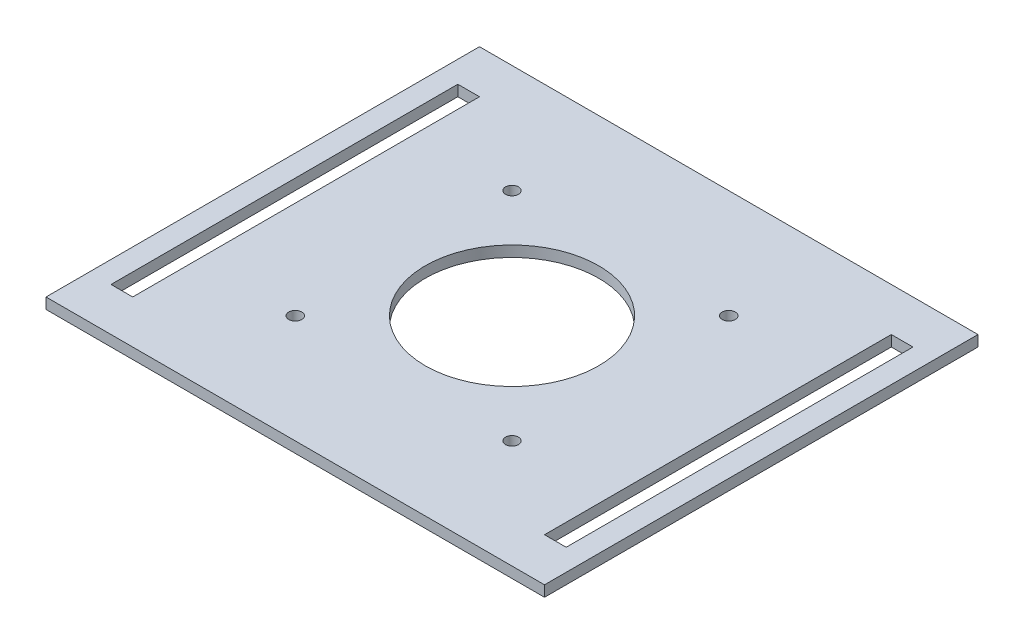
ISO-10303-21;
HEADER;
FILE_DESCRIPTION(('STEP AP214'),'2;1');
FILE_NAME('part.step','',(''),(''),'','','');
FILE_SCHEMA(('AUTOMOTIVE_DESIGN { 1 0 10303 214 1 1 1 1 }'));
ENDSEC;
DATA;
#1=APPLICATION_CONTEXT('core data for automotive mechanical design processes');
#2=APPLICATION_PROTOCOL_DEFINITION('international standard','automotive_design',2000,#1);
#3=PRODUCT_CONTEXT('',#1,'mechanical');
#4=PRODUCT('Part','Part','',(#3));
#5=PRODUCT_RELATED_PRODUCT_CATEGORY('part','',(#4));
#6=PRODUCT_DEFINITION_FORMATION('','',#4);
#7=PRODUCT_DEFINITION_CONTEXT('part definition',#1,'design');
#8=PRODUCT_DEFINITION('design','',#6,#7);
#9=PRODUCT_DEFINITION_SHAPE('','',#8);
#10=(LENGTH_UNIT() NAMED_UNIT(*) SI_UNIT(.MILLI.,.METRE.));
#11=(NAMED_UNIT(*) PLANE_ANGLE_UNIT() SI_UNIT($,.RADIAN.));
#12=(NAMED_UNIT(*) SI_UNIT($,.STERADIAN.) SOLID_ANGLE_UNIT());
#13=UNCERTAINTY_MEASURE_WITH_UNIT(LENGTH_MEASURE(1.E-05),#10,'distance_accuracy_value','');
#14=(GEOMETRIC_REPRESENTATION_CONTEXT(3) GLOBAL_UNCERTAINTY_ASSIGNED_CONTEXT((#13)) GLOBAL_UNIT_ASSIGNED_CONTEXT((#10,
#11,#12)) REPRESENTATION_CONTEXT('',''));
#15=CARTESIAN_POINT('',(0.,0.,0.));
#16=DIRECTION('',(0.,0.,1.));
#17=DIRECTION('',(1.,0.,0.));
#18=AXIS2_PLACEMENT_3D('',#15,#16,#17);
#19=CARTESIAN_POINT('',(1.11022302462516E-13,5.,-80.0000000000002));
#20=DIRECTION('',(0.,0.,1.));
#21=DIRECTION('',(1.,0.,0.));
#22=AXIS2_PLACEMENT_3D('',#19,#20,#21);
#23=PLANE('',#22);
#24=DIRECTION('',(-1.,0.,0.));
#25=VECTOR('',#24,1.);
#26=CARTESIAN_POINT('',(1.11022302462516E-13,0.,-80.0000000000002));
#27=LINE('',#26,#25);
#28=CARTESIAN_POINT('',(105.,0.,-80.));
#29=VERTEX_POINT('',#28);
#30=CARTESIAN_POINT('',(94.9999999999999,0.,-80.));
#31=VERTEX_POINT('',#30);
#32=EDGE_CURVE('E208',#29,#31,#27,.T.);
#33=ORIENTED_EDGE('',*,*,#32,.F.);
#34=DIRECTION('',(0.,-1.,0.));
#35=VECTOR('',#34,1.);
#36=CARTESIAN_POINT('',(105.,5.,-80.));
#37=LINE('',#36,#35);
#38=CARTESIAN_POINT('',(105.,5.,-80.));
#39=VERTEX_POINT('',#38);
#40=EDGE_CURVE('E11',#39,#29,#37,.T.);
#41=ORIENTED_EDGE('',*,*,#40,.F.);
#42=DIRECTION('',(-1.,0.,0.));
#43=VECTOR('',#42,1.);
#44=CARTESIAN_POINT('',(1.11022302462516E-13,5.,-80.0000000000002));
#45=LINE('',#44,#43);
#46=CARTESIAN_POINT('',(94.9999999999999,5.,-80.));
#47=VERTEX_POINT('',#46);
#48=EDGE_CURVE('E144',#39,#47,#45,.T.);
#49=ORIENTED_EDGE('',*,*,#48,.T.);
#50=DIRECTION('',(0.,-1.,0.));
#51=VECTOR('',#50,1.);
#52=CARTESIAN_POINT('',(94.9999999999999,5.,-80.));
#53=LINE('',#52,#51);
#54=EDGE_CURVE('E54',#47,#31,#53,.T.);
#55=ORIENTED_EDGE('',*,*,#54,.T.);
#56=EDGE_LOOP('',(#33,#41,#49,#55));
#57=FACE_BOUND('',#56,.T.);
#58=ADVANCED_FACE('F35',(#57),#23,.T.);
#59=CARTESIAN_POINT('',(105.,5.,0.));
#60=DIRECTION('',(1.,0.,0.));
#61=DIRECTION('',(0.,0.,-1.));
#62=AXIS2_PLACEMENT_3D('',#59,#60,#61);
#63=PLANE('',#62);
#64=DIRECTION('',(0.,0.,1.));
#65=VECTOR('',#64,1.);
#66=CARTESIAN_POINT('',(105.,0.,0.));
#67=LINE('',#66,#65);
#68=CARTESIAN_POINT('',(105.,0.,79.9999999999999));
#69=VERTEX_POINT('',#68);
#70=EDGE_CURVE('E149',#29,#69,#67,.T.);
#71=ORIENTED_EDGE('',*,*,#70,.T.);
#72=DIRECTION('',(0.,-1.,0.));
#73=VECTOR('',#72,1.);
#74=CARTESIAN_POINT('',(105.,5.,79.9999999999999));
#75=LINE('',#74,#73);
#76=CARTESIAN_POINT('',(105.,5.,79.9999999999999));
#77=VERTEX_POINT('',#76);
#78=EDGE_CURVE('E45',#77,#69,#75,.T.);
#79=ORIENTED_EDGE('',*,*,#78,.F.);
#80=DIRECTION('',(0.,0.,1.));
#81=VECTOR('',#80,1.);
#82=CARTESIAN_POINT('',(105.,5.,0.));
#83=LINE('',#82,#81);
#84=EDGE_CURVE('E139',#39,#77,#83,.T.);
#85=ORIENTED_EDGE('',*,*,#84,.F.);
#86=ORIENTED_EDGE('',*,*,#40,.T.);
#87=EDGE_LOOP('',(#71,#79,#85,#86));
#88=FACE_BOUND('',#87,.T.);
#89=ADVANCED_FACE('F147',(#88),#63,.F.);
#90=CARTESIAN_POINT('',(4.44089209850065E-13,5.,80.0000000000005));
#91=DIRECTION('',(0.,0.,1.));
#92=DIRECTION('',(1.,0.,0.));
#93=AXIS2_PLACEMENT_3D('',#90,#91,#92);
#94=PLANE('',#93);
#95=DIRECTION('',(-1.,0.,0.));
#96=VECTOR('',#95,1.);
#97=CARTESIAN_POINT('',(4.44089209850065E-13,0.,80.0000000000005));
#98=LINE('',#97,#96);
#99=CARTESIAN_POINT('',(95.,0.,80.));
#100=VERTEX_POINT('',#99);
#101=EDGE_CURVE('E211',#69,#100,#98,.T.);
#102=ORIENTED_EDGE('',*,*,#101,.T.);
#103=DIRECTION('',(0.,-1.,0.));
#104=VECTOR('',#103,1.);
#105=CARTESIAN_POINT('',(95.,5.,80.));
#106=LINE('',#105,#104);
#107=CARTESIAN_POINT('',(95.,5.,80.));
#108=VERTEX_POINT('',#107);
#109=EDGE_CURVE('E92',#108,#100,#106,.T.);
#110=ORIENTED_EDGE('',*,*,#109,.F.);
#111=DIRECTION('',(-1.,0.,0.));
#112=VECTOR('',#111,1.);
#113=CARTESIAN_POINT('',(4.44089209850065E-13,5.,80.0000000000005));
#114=LINE('',#113,#112);
#115=EDGE_CURVE('E131',#77,#108,#114,.T.);
#116=ORIENTED_EDGE('',*,*,#115,.F.);
#117=ORIENTED_EDGE('',*,*,#78,.T.);
#118=EDGE_LOOP('',(#102,#110,#116,#117));
#119=FACE_BOUND('',#118,.T.);
#120=ADVANCED_FACE('F133',(#119),#94,.F.);
#121=CARTESIAN_POINT('',(-1.11022302462516E-13,5.,-80.0000000000001));
#122=DIRECTION('',(0.,0.,-1.));
#123=DIRECTION('',(-1.,0.,0.));
#124=AXIS2_PLACEMENT_3D('',#121,#122,#123);
#125=PLANE('',#124);
#126=DIRECTION('',(1.,0.,0.));
#127=VECTOR('',#126,1.);
#128=CARTESIAN_POINT('',(-1.11022302462516E-13,0.,-80.0000000000001));
#129=LINE('',#128,#127);
#130=CARTESIAN_POINT('',(-105.,0.,-80.));
#131=VERTEX_POINT('',#130);
#132=CARTESIAN_POINT('',(-95.,0.,-80.));
#133=VERTEX_POINT('',#132);
#134=EDGE_CURVE('E196',#131,#133,#129,.T.);
#135=ORIENTED_EDGE('',*,*,#134,.T.);
#136=DIRECTION('',(0.,-1.,0.));
#137=VECTOR('',#136,1.);
#138=CARTESIAN_POINT('',(-95.,5.,-80.));
#139=LINE('',#138,#137);
#140=CARTESIAN_POINT('',(-95.,5.,-80.));
#141=VERTEX_POINT('',#140);
#142=EDGE_CURVE('E160',#141,#133,#139,.T.);
#143=ORIENTED_EDGE('',*,*,#142,.F.);
#144=DIRECTION('',(1.,0.,0.));
#145=VECTOR('',#144,1.);
#146=CARTESIAN_POINT('',(-1.11022302462516E-13,5.,-80.0000000000001));
#147=LINE('',#146,#145);
#148=CARTESIAN_POINT('',(-105.,5.,-80.));
#149=VERTEX_POINT('',#148);
#150=EDGE_CURVE('E226',#149,#141,#147,.T.);
#151=ORIENTED_EDGE('',*,*,#150,.F.);
#152=DIRECTION('',(0.,-1.,0.));
#153=VECTOR('',#152,1.);
#154=CARTESIAN_POINT('',(-105.,5.,-80.));
#155=LINE('',#154,#153);
#156=EDGE_CURVE('E154',#149,#131,#155,.T.);
#157=ORIENTED_EDGE('',*,*,#156,.T.);
#158=EDGE_LOOP('',(#135,#143,#151,#157));
#159=FACE_BOUND('',#158,.T.);
#160=ADVANCED_FACE('F270',(#159),#125,.F.);
#161=CARTESIAN_POINT('',(-95.,5.,0.));
#162=DIRECTION('',(1.,0.,0.));
#163=DIRECTION('',(0.,0.,-1.));
#164=AXIS2_PLACEMENT_3D('',#161,#162,#163);
#165=PLANE('',#164);
#166=DIRECTION('',(0.,0.,1.));
#167=VECTOR('',#166,1.);
#168=CARTESIAN_POINT('',(-95.,0.,0.));
#169=LINE('',#168,#167);
#170=CARTESIAN_POINT('',(-95.,0.,80.));
#171=VERTEX_POINT('',#170);
#172=EDGE_CURVE('E199',#133,#171,#169,.T.);
#173=ORIENTED_EDGE('',*,*,#172,.T.);
#174=DIRECTION('',(0.,-1.,0.));
#175=VECTOR('',#174,1.);
#176=CARTESIAN_POINT('',(-95.,5.,80.));
#177=LINE('',#176,#175);
#178=CARTESIAN_POINT('',(-95.,5.,80.));
#179=VERTEX_POINT('',#178);
#180=EDGE_CURVE('E158',#179,#171,#177,.T.);
#181=ORIENTED_EDGE('',*,*,#180,.F.);
#182=DIRECTION('',(0.,0.,1.));
#183=VECTOR('',#182,1.);
#184=CARTESIAN_POINT('',(-95.,5.,0.));
#185=LINE('',#184,#183);
#186=EDGE_CURVE('E229',#141,#179,#185,.T.);
#187=ORIENTED_EDGE('',*,*,#186,.F.);
#188=ORIENTED_EDGE('',*,*,#142,.T.);
#189=EDGE_LOOP('',(#173,#181,#187,#188));
#190=FACE_BOUND('',#189,.T.);
#191=ADVANCED_FACE('F266',(#190),#165,.F.);
#192=CARTESIAN_POINT('',(0.,5.,80.));
#193=DIRECTION('',(0.,0.,-1.));
#194=DIRECTION('',(-1.,0.,0.));
#195=AXIS2_PLACEMENT_3D('',#192,#193,#194);
#196=PLANE('',#195);
#197=DIRECTION('',(1.,0.,0.));
#198=VECTOR('',#197,1.);
#199=CARTESIAN_POINT('',(0.,0.,80.));
#200=LINE('',#199,#198);
#201=CARTESIAN_POINT('',(-105.,0.,80.));
#202=VERTEX_POINT('',#201);
#203=EDGE_CURVE('E202',#202,#171,#200,.T.);
#204=ORIENTED_EDGE('',*,*,#203,.F.);
#205=DIRECTION('',(0.,-1.,0.));
#206=VECTOR('',#205,1.);
#207=CARTESIAN_POINT('',(-105.,5.,80.));
#208=LINE('',#207,#206);
#209=CARTESIAN_POINT('',(-105.,5.,80.));
#210=VERTEX_POINT('',#209);
#211=EDGE_CURVE('E156',#210,#202,#208,.T.);
#212=ORIENTED_EDGE('',*,*,#211,.F.);
#213=DIRECTION('',(1.,0.,0.));
#214=VECTOR('',#213,1.);
#215=CARTESIAN_POINT('',(0.,5.,80.));
#216=LINE('',#215,#214);
#217=EDGE_CURVE('E231',#210,#179,#216,.T.);
#218=ORIENTED_EDGE('',*,*,#217,.T.);
#219=ORIENTED_EDGE('',*,*,#180,.T.);
#220=EDGE_LOOP('',(#204,#212,#218,#219));
#221=FACE_BOUND('',#220,.T.);
#222=ADVANCED_FACE('F263',(#221),#196,.T.);
#223=CARTESIAN_POINT('',(115.,5.,0.));
#224=DIRECTION('',(1.,0.,0.));
#225=DIRECTION('',(0.,0.,-1.));
#226=AXIS2_PLACEMENT_3D('',#223,#224,#225);
#227=PLANE('',#226);
#228=DIRECTION('',(0.,0.,1.));
#229=VECTOR('',#228,1.);
#230=CARTESIAN_POINT('',(115.,0.,0.));
#231=LINE('',#230,#229);
#232=CARTESIAN_POINT('',(115.,0.,-100.));
#233=VERTEX_POINT('',#232);
#234=CARTESIAN_POINT('',(115.,0.,100.));
#235=VERTEX_POINT('',#234);
#236=EDGE_CURVE('E180',#233,#235,#231,.T.);
#237=ORIENTED_EDGE('',*,*,#236,.F.);
#238=DIRECTION('',(0.,-1.,0.));
#239=VECTOR('',#238,1.);
#240=CARTESIAN_POINT('',(115.,5.,-100.));
#241=LINE('',#240,#239);
#242=CARTESIAN_POINT('',(115.,5.,-100.));
#243=VERTEX_POINT('',#242);
#244=EDGE_CURVE('E39',#243,#233,#241,.T.);
#245=ORIENTED_EDGE('',*,*,#244,.F.);
#246=DIRECTION('',(0.,0.,1.));
#247=VECTOR('',#246,1.);
#248=CARTESIAN_POINT('',(115.,5.,0.));
#249=LINE('',#248,#247);
#250=CARTESIAN_POINT('',(115.,5.,100.));
#251=VERTEX_POINT('',#250);
#252=EDGE_CURVE('E215',#243,#251,#249,.T.);
#253=ORIENTED_EDGE('',*,*,#252,.T.);
#254=DIRECTION('',(0.,-1.,0.));
#255=VECTOR('',#254,1.);
#256=CARTESIAN_POINT('',(115.,5.,100.));
#257=LINE('',#256,#255);
#258=EDGE_CURVE('E163',#251,#235,#257,.T.);
#259=ORIENTED_EDGE('',*,*,#258,.T.);
#260=EDGE_LOOP('',(#237,#245,#253,#259));
#261=FACE_BOUND('',#260,.T.);
#262=ADVANCED_FACE('F37',(#261),#227,.T.);
#263=CARTESIAN_POINT('',(0.,5.,-100.));
#264=DIRECTION('',(0.,0.,-1.));
#265=DIRECTION('',(-1.,0.,0.));
#266=AXIS2_PLACEMENT_3D('',#263,#264,#265);
#267=PLANE('',#266);
#268=DIRECTION('',(1.,0.,0.));
#269=VECTOR('',#268,1.);
#270=CARTESIAN_POINT('',(0.,0.,-100.));
#271=LINE('',#270,#269);
#272=CARTESIAN_POINT('',(-115.,0.,-100.));
#273=VERTEX_POINT('',#272);
#274=EDGE_CURVE('E176',#273,#233,#271,.T.);
#275=ORIENTED_EDGE('',*,*,#274,.F.);
#276=DIRECTION('',(0.,-1.,0.));
#277=VECTOR('',#276,1.);
#278=CARTESIAN_POINT('',(-115.,5.,-100.));
#279=LINE('',#278,#277);
#280=CARTESIAN_POINT('',(-115.,5.,-100.));
#281=VERTEX_POINT('',#280);
#282=EDGE_CURVE('E167',#281,#273,#279,.T.);
#283=ORIENTED_EDGE('',*,*,#282,.F.);
#284=DIRECTION('',(1.,0.,0.));
#285=VECTOR('',#284,1.);
#286=CARTESIAN_POINT('',(0.,5.,-100.));
#287=LINE('',#286,#285);
#288=EDGE_CURVE('E178',#281,#243,#287,.T.);
#289=ORIENTED_EDGE('',*,*,#288,.T.);
#290=ORIENTED_EDGE('',*,*,#244,.T.);
#291=EDGE_LOOP('',(#275,#283,#289,#290));
#292=FACE_BOUND('',#291,.T.);
#293=ADVANCED_FACE('F174',(#292),#267,.T.);
#294=CARTESIAN_POINT('',(-115.,5.,0.));
#295=DIRECTION('',(1.,0.,0.));
#296=DIRECTION('',(0.,0.,-1.));
#297=AXIS2_PLACEMENT_3D('',#294,#295,#296);
#298=PLANE('',#297);
#299=DIRECTION('',(0.,0.,1.));
#300=VECTOR('',#299,1.);
#301=CARTESIAN_POINT('',(-115.,0.,0.));
#302=LINE('',#301,#300);
#303=CARTESIAN_POINT('',(-115.,0.,100.));
#304=VERTEX_POINT('',#303);
#305=EDGE_CURVE('E189',#273,#304,#302,.T.);
#306=ORIENTED_EDGE('',*,*,#305,.T.);
#307=DIRECTION('',(0.,-1.,0.));
#308=VECTOR('',#307,1.);
#309=CARTESIAN_POINT('',(-115.,5.,100.));
#310=LINE('',#309,#308);
#311=CARTESIAN_POINT('',(-115.,5.,100.));
#312=VERTEX_POINT('',#311);
#313=EDGE_CURVE('E165',#312,#304,#310,.T.);
#314=ORIENTED_EDGE('',*,*,#313,.F.);
#315=DIRECTION('',(0.,0.,1.));
#316=VECTOR('',#315,1.);
#317=CARTESIAN_POINT('',(-115.,5.,0.));
#318=LINE('',#317,#316);
#319=EDGE_CURVE('E218',#281,#312,#318,.T.);
#320=ORIENTED_EDGE('',*,*,#319,.F.);
#321=ORIENTED_EDGE('',*,*,#282,.T.);
#322=EDGE_LOOP('',(#306,#314,#320,#321));
#323=FACE_BOUND('',#322,.T.);
#324=ADVANCED_FACE('F261',(#323),#298,.F.);
#325=CARTESIAN_POINT('',(-105.,5.,0.));
#326=DIRECTION('',(1.,0.,0.));
#327=DIRECTION('',(0.,0.,-1.));
#328=AXIS2_PLACEMENT_3D('',#325,#326,#327);
#329=PLANE('',#328);
#330=DIRECTION('',(0.,0.,1.));
#331=VECTOR('',#330,1.);
#332=CARTESIAN_POINT('',(-105.,0.,0.));
#333=LINE('',#332,#331);
#334=EDGE_CURVE('E205',#131,#202,#333,.T.);
#335=ORIENTED_EDGE('',*,*,#334,.F.);
#336=ORIENTED_EDGE('',*,*,#156,.F.);
#337=DIRECTION('',(0.,0.,1.));
#338=VECTOR('',#337,1.);
#339=CARTESIAN_POINT('',(-105.,5.,0.));
#340=LINE('',#339,#338);
#341=EDGE_CURVE('E234',#149,#210,#340,.T.);
#342=ORIENTED_EDGE('',*,*,#341,.T.);
#343=ORIENTED_EDGE('',*,*,#211,.T.);
#344=EDGE_LOOP('',(#335,#336,#342,#343));
#345=FACE_BOUND('',#344,.T.);
#346=ADVANCED_FACE('F247',(#345),#329,.T.);
#347=CARTESIAN_POINT('',(0.,5.,100.));
#348=DIRECTION('',(0.,0.,-1.));
#349=DIRECTION('',(-1.,0.,0.));
#350=AXIS2_PLACEMENT_3D('',#347,#348,#349);
#351=PLANE('',#350);
#352=DIRECTION('',(1.,0.,0.));
#353=VECTOR('',#352,1.);
#354=CARTESIAN_POINT('',(0.,0.,100.));
#355=LINE('',#354,#353);
#356=EDGE_CURVE('E191',#304,#235,#355,.T.);
#357=ORIENTED_EDGE('',*,*,#356,.T.);
#358=ORIENTED_EDGE('',*,*,#258,.F.);
#359=DIRECTION('',(1.,0.,0.));
#360=VECTOR('',#359,1.);
#361=CARTESIAN_POINT('',(0.,5.,100.));
#362=LINE('',#361,#360);
#363=EDGE_CURVE('E224',#312,#251,#362,.T.);
#364=ORIENTED_EDGE('',*,*,#363,.F.);
#365=ORIENTED_EDGE('',*,*,#313,.T.);
#366=EDGE_LOOP('',(#357,#358,#364,#365));
#367=FACE_BOUND('',#366,.T.);
#368=ADVANCED_FACE('F239',(#367),#351,.F.);
#369=CARTESIAN_POINT('',(95.,5.,0.));
#370=DIRECTION('',(1.,0.,0.));
#371=DIRECTION('',(0.,0.,-1.));
#372=AXIS2_PLACEMENT_3D('',#369,#370,#371);
#373=PLANE('',#372);
#374=DIRECTION('',(0.,0.,1.));
#375=VECTOR('',#374,1.);
#376=CARTESIAN_POINT('',(95.,0.,0.));
#377=LINE('',#376,#375);
#378=EDGE_CURVE('E213',#31,#100,#377,.T.);
#379=ORIENTED_EDGE('',*,*,#378,.F.);
#380=ORIENTED_EDGE('',*,*,#54,.F.);
#381=DIRECTION('',(0.,0.,1.));
#382=VECTOR('',#381,1.);
#383=CARTESIAN_POINT('',(95.,5.,0.));
#384=LINE('',#383,#382);
#385=EDGE_CURVE('E138',#47,#108,#384,.T.);
#386=ORIENTED_EDGE('',*,*,#385,.T.);
#387=ORIENTED_EDGE('',*,*,#109,.T.);
#388=EDGE_LOOP('',(#379,#380,#386,#387));
#389=FACE_BOUND('',#388,.T.);
#390=ADVANCED_FACE('F237',(#389),#373,.T.);
#391=CARTESIAN_POINT('',(0.,5.,0.));
#392=DIRECTION('',(0.,1.,0.));
#393=DIRECTION('',(0.,0.,1.));
#394=AXIS2_PLACEMENT_3D('',#391,#392,#393);
#395=PLANE('',#394);
#396=CARTESIAN_POINT('',(-50.,5.,50.));
#397=DIRECTION('',(0.,1.,0.));
#398=DIRECTION('',(0.,0.,1.));
#399=AXIS2_PLACEMENT_3D('',#396,#397,#398);
#400=CIRCLE('',#399,3.);
#401=CARTESIAN_POINT('',(-50.,5.,53.));
#402=VERTEX_POINT('',#401);
#403=EDGE_CURVE('E414',#402,#402,#400,.T.);
#404=ORIENTED_EDGE('',*,*,#403,.F.);
#405=EDGE_LOOP('',(#404));
#406=FACE_BOUND('',#405,.T.);
#407=CARTESIAN_POINT('',(50.,5.,50.));
#408=DIRECTION('',(0.,1.,0.));
#409=DIRECTION('',(0.,0.,1.));
#410=AXIS2_PLACEMENT_3D('',#407,#408,#409);
#411=CIRCLE('',#410,3.);
#412=CARTESIAN_POINT('',(50.,5.,53.));
#413=VERTEX_POINT('',#412);
#414=EDGE_CURVE('E416',#413,#413,#411,.T.);
#415=ORIENTED_EDGE('',*,*,#414,.F.);
#416=EDGE_LOOP('',(#415));
#417=FACE_BOUND('',#416,.T.);
#418=CARTESIAN_POINT('',(50.,5.,-50.));
#419=DIRECTION('',(0.,1.,0.));
#420=DIRECTION('',(0.,0.,1.));
#421=AXIS2_PLACEMENT_3D('',#418,#419,#420);
#422=CIRCLE('',#421,3.);
#423=CARTESIAN_POINT('',(50.,5.,-47.));
#424=VERTEX_POINT('',#423);
#425=EDGE_CURVE('E435',#424,#424,#422,.T.);
#426=ORIENTED_EDGE('',*,*,#425,.F.);
#427=EDGE_LOOP('',(#426));
#428=FACE_BOUND('',#427,.T.);
#429=CARTESIAN_POINT('',(-50.,5.,-50.));
#430=DIRECTION('',(0.,1.,0.));
#431=DIRECTION('',(0.,0.,1.));
#432=AXIS2_PLACEMENT_3D('',#429,#430,#431);
#433=CIRCLE('',#432,3.);
#434=CARTESIAN_POINT('',(-50.,5.,-47.));
#435=VERTEX_POINT('',#434);
#436=EDGE_CURVE('E428',#435,#435,#433,.T.);
#437=ORIENTED_EDGE('',*,*,#436,.F.);
#438=EDGE_LOOP('',(#437));
#439=FACE_BOUND('',#438,.T.);
#440=CARTESIAN_POINT('',(0.,5.,0.));
#441=DIRECTION('',(0.,1.,0.));
#442=DIRECTION('',(0.,0.,1.));
#443=AXIS2_PLACEMENT_3D('',#440,#441,#442);
#444=CIRCLE('',#443,40.);
#445=CARTESIAN_POINT('',(0.,5.,40.));
#446=VERTEX_POINT('',#445);
#447=EDGE_CURVE('E421',#446,#446,#444,.T.);
#448=ORIENTED_EDGE('',*,*,#447,.F.);
#449=EDGE_LOOP('',(#448));
#450=FACE_BOUND('',#449,.T.);
#451=ORIENTED_EDGE('',*,*,#252,.F.);
#452=ORIENTED_EDGE('',*,*,#288,.F.);
#453=ORIENTED_EDGE('',*,*,#319,.T.);
#454=ORIENTED_EDGE('',*,*,#363,.T.);
#455=EDGE_LOOP('',(#451,#452,#453,#454));
#456=FACE_BOUND('',#455,.T.);
#457=ORIENTED_EDGE('',*,*,#150,.T.);
#458=ORIENTED_EDGE('',*,*,#186,.T.);
#459=ORIENTED_EDGE('',*,*,#217,.F.);
#460=ORIENTED_EDGE('',*,*,#341,.F.);
#461=EDGE_LOOP('',(#457,#458,#459,#460));
#462=FACE_BOUND('',#461,.T.);
#463=ORIENTED_EDGE('',*,*,#48,.F.);
#464=ORIENTED_EDGE('',*,*,#84,.T.);
#465=ORIENTED_EDGE('',*,*,#115,.T.);
#466=ORIENTED_EDGE('',*,*,#385,.F.);
#467=EDGE_LOOP('',(#463,#464,#465,#466));
#468=FACE_BOUND('',#467,.T.);
#469=ADVANCED_FACE('F143',(#406,#417,#428,#439,#450,#456,#462,#468),#395,.T.);
#470=CARTESIAN_POINT('',(0.,0.,0.));
#471=DIRECTION('',(0.,1.,0.));
#472=DIRECTION('',(0.,0.,1.));
#473=AXIS2_PLACEMENT_3D('',#470,#471,#472);
#474=PLANE('',#473);
#475=CARTESIAN_POINT('',(-50.,0.,50.));
#476=DIRECTION('',(0.,1.,0.));
#477=DIRECTION('',(0.,0.,1.));
#478=AXIS2_PLACEMENT_3D('',#475,#476,#477);
#479=CIRCLE('',#478,3.);
#480=CARTESIAN_POINT('',(-50.,0.,53.));
#481=VERTEX_POINT('',#480);
#482=EDGE_CURVE('E411',#481,#481,#479,.F.);
#483=ORIENTED_EDGE('',*,*,#482,.F.);
#484=EDGE_LOOP('',(#483));
#485=FACE_BOUND('',#484,.T.);
#486=CARTESIAN_POINT('',(50.,0.,50.));
#487=DIRECTION('',(0.,1.,0.));
#488=DIRECTION('',(0.,0.,1.));
#489=AXIS2_PLACEMENT_3D('',#486,#487,#488);
#490=CIRCLE('',#489,3.);
#491=CARTESIAN_POINT('',(50.,0.,53.));
#492=VERTEX_POINT('',#491);
#493=EDGE_CURVE('E419',#492,#492,#490,.F.);
#494=ORIENTED_EDGE('',*,*,#493,.F.);
#495=EDGE_LOOP('',(#494));
#496=FACE_BOUND('',#495,.T.);
#497=CARTESIAN_POINT('',(50.,0.,-50.));
#498=DIRECTION('',(0.,1.,0.));
#499=DIRECTION('',(0.,0.,1.));
#500=AXIS2_PLACEMENT_3D('',#497,#498,#499);
#501=CIRCLE('',#500,3.);
#502=CARTESIAN_POINT('',(50.,0.,-47.));
#503=VERTEX_POINT('',#502);
#504=EDGE_CURVE('E432',#503,#503,#501,.F.);
#505=ORIENTED_EDGE('',*,*,#504,.F.);
#506=EDGE_LOOP('',(#505));
#507=FACE_BOUND('',#506,.T.);
#508=CARTESIAN_POINT('',(-50.,0.,-50.));
#509=DIRECTION('',(0.,1.,0.));
#510=DIRECTION('',(0.,0.,1.));
#511=AXIS2_PLACEMENT_3D('',#508,#509,#510);
#512=CIRCLE('',#511,3.);
#513=CARTESIAN_POINT('',(-50.,0.,-47.));
#514=VERTEX_POINT('',#513);
#515=EDGE_CURVE('E423',#514,#514,#512,.F.);
#516=ORIENTED_EDGE('',*,*,#515,.F.);
#517=EDGE_LOOP('',(#516));
#518=FACE_BOUND('',#517,.T.);
#519=CARTESIAN_POINT('',(0.,0.,0.));
#520=DIRECTION('',(0.,1.,0.));
#521=DIRECTION('',(0.,0.,1.));
#522=AXIS2_PLACEMENT_3D('',#519,#520,#521);
#523=CIRCLE('',#522,40.);
#524=CARTESIAN_POINT('',(0.,0.,40.));
#525=VERTEX_POINT('',#524);
#526=EDGE_CURVE('E185',#525,#525,#523,.F.);
#527=ORIENTED_EDGE('',*,*,#526,.F.);
#528=EDGE_LOOP('',(#527));
#529=FACE_BOUND('',#528,.T.);
#530=ORIENTED_EDGE('',*,*,#236,.T.);
#531=ORIENTED_EDGE('',*,*,#356,.F.);
#532=ORIENTED_EDGE('',*,*,#305,.F.);
#533=ORIENTED_EDGE('',*,*,#274,.T.);
#534=EDGE_LOOP('',(#530,#531,#532,#533));
#535=FACE_BOUND('',#534,.T.);
#536=ORIENTED_EDGE('',*,*,#134,.F.);
#537=ORIENTED_EDGE('',*,*,#334,.T.);
#538=ORIENTED_EDGE('',*,*,#203,.T.);
#539=ORIENTED_EDGE('',*,*,#172,.F.);
#540=EDGE_LOOP('',(#536,#537,#538,#539));
#541=FACE_BOUND('',#540,.T.);
#542=ORIENTED_EDGE('',*,*,#32,.T.);
#543=ORIENTED_EDGE('',*,*,#378,.T.);
#544=ORIENTED_EDGE('',*,*,#101,.F.);
#545=ORIENTED_EDGE('',*,*,#70,.F.);
#546=EDGE_LOOP('',(#542,#543,#544,#545));
#547=FACE_BOUND('',#546,.T.);
#548=ADVANCED_FACE('F187',(#485,#496,#507,#518,#529,#535,#541,#547),#474,.F.);
#549=CARTESIAN_POINT('',(0.,-113.137084989848,0.));
#550=DIRECTION('',(0.,1.,0.));
#551=DIRECTION('',(0.,0.,1.));
#552=AXIS2_PLACEMENT_3D('',#549,#550,#551);
#553=CYLINDRICAL_SURFACE('',#552,40.);
#554=ORIENTED_EDGE('',*,*,#526,.T.);
#555=EDGE_LOOP('',(#554));
#556=FACE_BOUND('',#555,.T.);
#557=ORIENTED_EDGE('',*,*,#447,.T.);
#558=EDGE_LOOP('',(#557));
#559=FACE_BOUND('',#558,.T.);
#560=ADVANCED_FACE('F355',(#556,#559),#553,.F.);
#561=CARTESIAN_POINT('',(-50.,-113.137084989848,-50.));
#562=DIRECTION('',(0.,1.,0.));
#563=DIRECTION('',(0.,0.,1.));
#564=AXIS2_PLACEMENT_3D('',#561,#562,#563);
#565=CYLINDRICAL_SURFACE('',#564,3.);
#566=ORIENTED_EDGE('',*,*,#515,.T.);
#567=EDGE_LOOP('',(#566));
#568=FACE_BOUND('',#567,.T.);
#569=ORIENTED_EDGE('',*,*,#436,.T.);
#570=EDGE_LOOP('',(#569));
#571=FACE_BOUND('',#570,.T.);
#572=ADVANCED_FACE('F363',(#568,#571),#565,.F.);
#573=CARTESIAN_POINT('',(50.,-113.137084989848,-50.));
#574=DIRECTION('',(0.,1.,0.));
#575=DIRECTION('',(0.,0.,1.));
#576=AXIS2_PLACEMENT_3D('',#573,#574,#575);
#577=CYLINDRICAL_SURFACE('',#576,3.);
#578=ORIENTED_EDGE('',*,*,#504,.T.);
#579=EDGE_LOOP('',(#578));
#580=FACE_BOUND('',#579,.T.);
#581=ORIENTED_EDGE('',*,*,#425,.T.);
#582=EDGE_LOOP('',(#581));
#583=FACE_BOUND('',#582,.T.);
#584=ADVANCED_FACE('F372',(#580,#583),#577,.F.);
#585=CARTESIAN_POINT('',(50.,-113.137084989848,50.));
#586=DIRECTION('',(0.,1.,0.));
#587=DIRECTION('',(0.,0.,1.));
#588=AXIS2_PLACEMENT_3D('',#585,#586,#587);
#589=CYLINDRICAL_SURFACE('',#588,3.);
#590=ORIENTED_EDGE('',*,*,#493,.T.);
#591=EDGE_LOOP('',(#590));
#592=FACE_BOUND('',#591,.T.);
#593=ORIENTED_EDGE('',*,*,#414,.T.);
#594=EDGE_LOOP('',(#593));
#595=FACE_BOUND('',#594,.T.);
#596=ADVANCED_FACE('F381',(#592,#595),#589,.F.);
#597=CARTESIAN_POINT('',(-50.,-113.137084989848,50.));
#598=DIRECTION('',(0.,1.,0.));
#599=DIRECTION('',(0.,0.,1.));
#600=AXIS2_PLACEMENT_3D('',#597,#598,#599);
#601=CYLINDRICAL_SURFACE('',#600,3.);
#602=ORIENTED_EDGE('',*,*,#482,.T.);
#603=EDGE_LOOP('',(#602));
#604=FACE_BOUND('',#603,.T.);
#605=ORIENTED_EDGE('',*,*,#403,.T.);
#606=EDGE_LOOP('',(#605));
#607=FACE_BOUND('',#606,.T.);
#608=ADVANCED_FACE('F390',(#604,#607),#601,.F.);
#609=CLOSED_SHELL('',(#58,#89,#120,#160,#191,#222,#262,#293,#324,#346,#368,#390,#469,#548,#560,
#572,#584,#596,#608));
#610=MANIFOLD_SOLID_BREP('B2',#609);
#611=ADVANCED_BREP_SHAPE_REPRESENTATION('',(#18,#610),#14);
#612=SHAPE_DEFINITION_REPRESENTATION(#9,#611);
ENDSEC;
END-ISO-10303-21;
